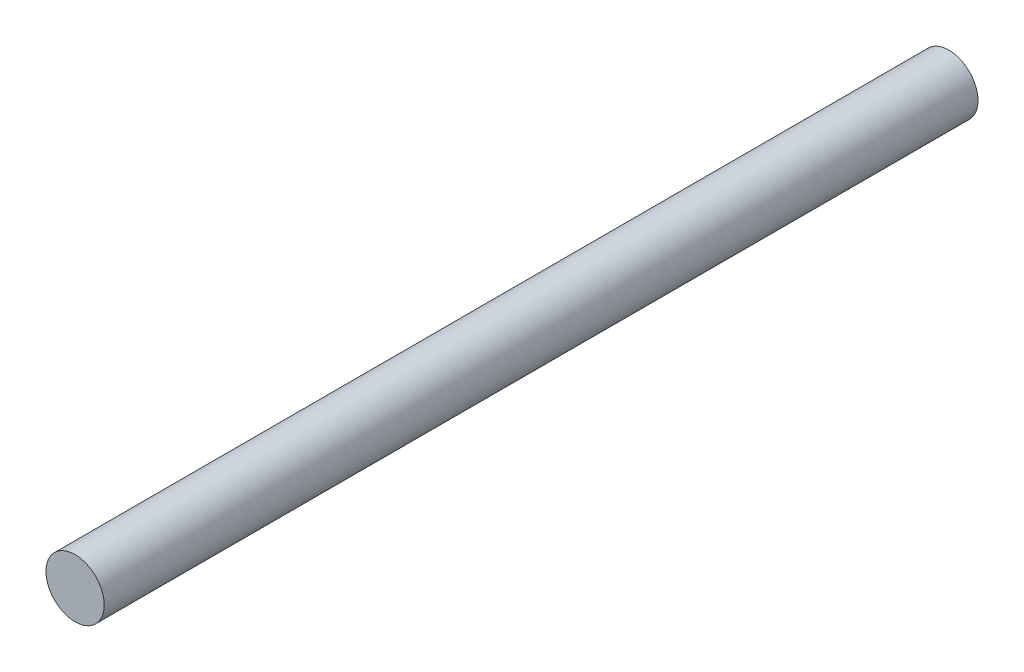
ISO-10303-21;
HEADER;
FILE_DESCRIPTION(('STEP AP214'),'2;1');
FILE_NAME('part.step','',(''),(''),'','','');
FILE_SCHEMA(('AUTOMOTIVE_DESIGN { 1 0 10303 214 1 1 1 1 }'));
ENDSEC;
DATA;
#1=APPLICATION_CONTEXT('core data for automotive mechanical design processes');
#2=APPLICATION_PROTOCOL_DEFINITION('international standard','automotive_design',2000,#1);
#3=PRODUCT_CONTEXT('',#1,'mechanical');
#4=PRODUCT('Part','Part','',(#3));
#5=PRODUCT_RELATED_PRODUCT_CATEGORY('part','',(#4));
#6=PRODUCT_DEFINITION_FORMATION('','',#4);
#7=PRODUCT_DEFINITION_CONTEXT('part definition',#1,'design');
#8=PRODUCT_DEFINITION('design','',#6,#7);
#9=PRODUCT_DEFINITION_SHAPE('','',#8);
#10=(LENGTH_UNIT() NAMED_UNIT(*) SI_UNIT(.MILLI.,.METRE.));
#11=(NAMED_UNIT(*) PLANE_ANGLE_UNIT() SI_UNIT($,.RADIAN.));
#12=(NAMED_UNIT(*) SI_UNIT($,.STERADIAN.) SOLID_ANGLE_UNIT());
#13=UNCERTAINTY_MEASURE_WITH_UNIT(LENGTH_MEASURE(1.E-05),#10,'distance_accuracy_value','');
#14=(GEOMETRIC_REPRESENTATION_CONTEXT(3) GLOBAL_UNCERTAINTY_ASSIGNED_CONTEXT((#13)) GLOBAL_UNIT_ASSIGNED_CONTEXT((#10,
#11,#12)) REPRESENTATION_CONTEXT('',''));
#15=CARTESIAN_POINT('',(0.,0.,0.));
#16=DIRECTION('',(0.,0.,1.));
#17=DIRECTION('',(1.,0.,0.));
#18=AXIS2_PLACEMENT_3D('',#15,#16,#17);
#19=CARTESIAN_POINT('',(0.,0.,150.));
#20=DIRECTION('',(0.,0.,-1.));
#21=DIRECTION('',(-1.,0.,0.));
#22=AXIS2_PLACEMENT_3D('',#19,#20,#21);
#23=CYLINDRICAL_SURFACE('',#22,5.);
#24=CARTESIAN_POINT('',(0.,0.,150.));
#25=DIRECTION('',(0.,0.,1.));
#26=DIRECTION('',(1.,0.,0.));
#27=AXIS2_PLACEMENT_3D('',#24,#25,#26);
#28=CIRCLE('',#27,5.);
#29=CARTESIAN_POINT('',(5.,0.,150.));
#30=VERTEX_POINT('',#29);
#31=EDGE_CURVE('E10',#30,#30,#28,.T.);
#32=ORIENTED_EDGE('',*,*,#31,.F.);
#33=EDGE_LOOP('',(#32));
#34=FACE_BOUND('',#33,.T.);
#35=CARTESIAN_POINT('',(0.,0.,0.));
#36=DIRECTION('',(0.,0.,1.));
#37=DIRECTION('',(1.,0.,0.));
#38=AXIS2_PLACEMENT_3D('',#35,#36,#37);
#39=CIRCLE('',#38,5.);
#40=CARTESIAN_POINT('',(5.,0.,0.));
#41=VERTEX_POINT('',#40);
#42=EDGE_CURVE('E40',#41,#41,#39,.T.);
#43=ORIENTED_EDGE('',*,*,#42,.T.);
#44=EDGE_LOOP('',(#43));
#45=FACE_BOUND('',#44,.T.);
#46=ADVANCED_FACE('F37',(#34,#45),#23,.T.);
#47=CARTESIAN_POINT('',(0.,0.,150.));
#48=DIRECTION('',(0.,0.,1.));
#49=DIRECTION('',(1.,0.,0.));
#50=AXIS2_PLACEMENT_3D('',#47,#48,#49);
#51=PLANE('',#50);
#52=ORIENTED_EDGE('',*,*,#31,.T.);
#53=EDGE_LOOP('',(#52));
#54=FACE_BOUND('',#53,.T.);
#55=ADVANCED_FACE('F52',(#54),#51,.T.);
#56=CARTESIAN_POINT('',(0.,0.,0.));
#57=DIRECTION('',(0.,0.,1.));
#58=DIRECTION('',(1.,0.,0.));
#59=AXIS2_PLACEMENT_3D('',#56,#57,#58);
#60=PLANE('',#59);
#61=ORIENTED_EDGE('',*,*,#42,.F.);
#62=EDGE_LOOP('',(#61));
#63=FACE_BOUND('',#62,.T.);
#64=ADVANCED_FACE('F50',(#63),#60,.F.);
#65=CLOSED_SHELL('',(#46,#55,#64));
#66=MANIFOLD_SOLID_BREP('B2',#65);
#67=ADVANCED_BREP_SHAPE_REPRESENTATION('',(#18,#66),#14);
#68=SHAPE_DEFINITION_REPRESENTATION(#9,#67);
ENDSEC;
END-ISO-10303-21;
